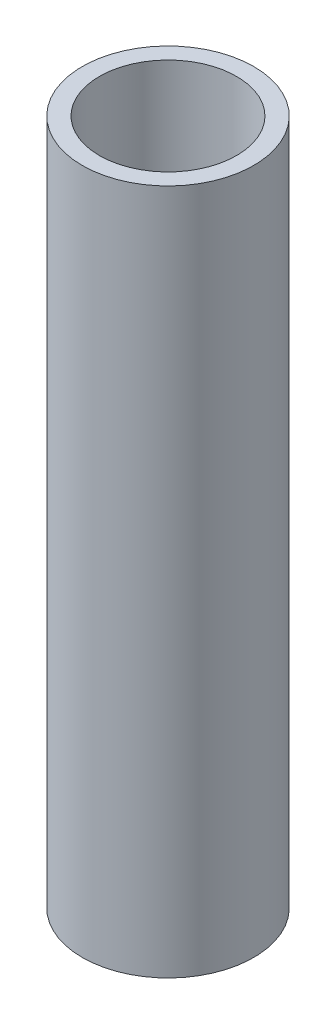
ISO-10303-21;
HEADER;
FILE_DESCRIPTION(('STEP AP214'),'2;1');
FILE_NAME('part.step','',(''),(''),'','','');
FILE_SCHEMA(('AUTOMOTIVE_DESIGN { 1 0 10303 214 1 1 1 1 }'));
ENDSEC;
DATA;
#1=APPLICATION_CONTEXT('core data for automotive mechanical design processes');
#2=APPLICATION_PROTOCOL_DEFINITION('international standard','automotive_design',2000,#1);
#3=PRODUCT_CONTEXT('',#1,'mechanical');
#4=PRODUCT('Part','Part','',(#3));
#5=PRODUCT_RELATED_PRODUCT_CATEGORY('part','',(#4));
#6=PRODUCT_DEFINITION_FORMATION('','',#4);
#7=PRODUCT_DEFINITION_CONTEXT('part definition',#1,'design');
#8=PRODUCT_DEFINITION('design','',#6,#7);
#9=PRODUCT_DEFINITION_SHAPE('','',#8);
#10=(LENGTH_UNIT() NAMED_UNIT(*) SI_UNIT(.MILLI.,.METRE.));
#11=(NAMED_UNIT(*) PLANE_ANGLE_UNIT() SI_UNIT($,.RADIAN.));
#12=(NAMED_UNIT(*) SI_UNIT($,.STERADIAN.) SOLID_ANGLE_UNIT());
#13=UNCERTAINTY_MEASURE_WITH_UNIT(LENGTH_MEASURE(1.E-05),#10,'distance_accuracy_value','');
#14=(GEOMETRIC_REPRESENTATION_CONTEXT(3) GLOBAL_UNCERTAINTY_ASSIGNED_CONTEXT((#13)) GLOBAL_UNIT_ASSIGNED_CONTEXT((#10,
#11,#12)) REPRESENTATION_CONTEXT('',''));
#15=CARTESIAN_POINT('',(0.,0.,0.));
#16=DIRECTION('',(0.,0.,1.));
#17=DIRECTION('',(1.,0.,0.));
#18=AXIS2_PLACEMENT_3D('',#15,#16,#17);
#19=CARTESIAN_POINT('',(0.,100.,0.));
#20=DIRECTION('',(0.,1.,0.));
#21=DIRECTION('',(0.,0.,1.));
#22=AXIS2_PLACEMENT_3D('',#19,#20,#21);
#23=PLANE('',#22);
#24=CARTESIAN_POINT('',(0.,100.,0.));
#25=DIRECTION('',(0.,1.,0.));
#26=DIRECTION('',(0.,0.,1.));
#27=AXIS2_PLACEMENT_3D('',#24,#25,#26);
#28=CIRCLE('',#27,12.5);
#29=CARTESIAN_POINT('',(0.,100.,12.5));
#30=VERTEX_POINT('',#29);
#31=EDGE_CURVE('E10',#30,#30,#28,.T.);
#32=ORIENTED_EDGE('',*,*,#31,.T.);
#33=EDGE_LOOP('',(#32));
#34=FACE_BOUND('',#33,.T.);
#35=CARTESIAN_POINT('',(0.,100.,0.));
#36=DIRECTION('',(0.,1.,0.));
#37=DIRECTION('',(0.,0.,1.));
#38=AXIS2_PLACEMENT_3D('',#35,#36,#37);
#39=CIRCLE('',#38,10.);
#40=CARTESIAN_POINT('',(0.,100.,10.));
#41=VERTEX_POINT('',#40);
#42=EDGE_CURVE('E46',#41,#41,#39,.T.);
#43=ORIENTED_EDGE('',*,*,#42,.F.);
#44=EDGE_LOOP('',(#43));
#45=FACE_BOUND('',#44,.T.);
#46=ADVANCED_FACE('F35',(#34,#45),#23,.T.);
#47=CARTESIAN_POINT('',(0.,0.,0.));
#48=DIRECTION('',(0.,1.,0.));
#49=DIRECTION('',(0.,0.,1.));
#50=AXIS2_PLACEMENT_3D('',#47,#48,#49);
#51=PLANE('',#50);
#52=CARTESIAN_POINT('',(0.,0.,0.));
#53=DIRECTION('',(0.,1.,0.));
#54=DIRECTION('',(0.,0.,1.));
#55=AXIS2_PLACEMENT_3D('',#52,#53,#54);
#56=CIRCLE('',#55,12.5);
#57=CARTESIAN_POINT('',(0.,0.,12.5));
#58=VERTEX_POINT('',#57);
#59=EDGE_CURVE('E39',#58,#58,#56,.T.);
#60=ORIENTED_EDGE('',*,*,#59,.F.);
#61=EDGE_LOOP('',(#60));
#62=FACE_BOUND('',#61,.T.);
#63=CARTESIAN_POINT('',(0.,0.,0.));
#64=DIRECTION('',(0.,1.,0.));
#65=DIRECTION('',(0.,0.,1.));
#66=AXIS2_PLACEMENT_3D('',#63,#64,#65);
#67=CIRCLE('',#66,10.);
#68=CARTESIAN_POINT('',(0.,0.,10.));
#69=VERTEX_POINT('',#68);
#70=EDGE_CURVE('E48',#69,#69,#67,.T.);
#71=ORIENTED_EDGE('',*,*,#70,.T.);
#72=EDGE_LOOP('',(#71));
#73=FACE_BOUND('',#72,.T.);
#74=ADVANCED_FACE('F58',(#62,#73),#51,.F.);
#75=CARTESIAN_POINT('',(0.,100.,0.));
#76=DIRECTION('',(0.,-1.,0.));
#77=DIRECTION('',(0.,0.,-1.));
#78=AXIS2_PLACEMENT_3D('',#75,#76,#77);
#79=CYLINDRICAL_SURFACE('',#78,12.5);
#80=ORIENTED_EDGE('',*,*,#31,.F.);
#81=EDGE_LOOP('',(#80));
#82=FACE_BOUND('',#81,.T.);
#83=ORIENTED_EDGE('',*,*,#59,.T.);
#84=EDGE_LOOP('',(#83));
#85=FACE_BOUND('',#84,.T.);
#86=ADVANCED_FACE('F37',(#82,#85),#79,.T.);
#87=CARTESIAN_POINT('',(0.,100.,0.));
#88=DIRECTION('',(0.,-1.,0.));
#89=DIRECTION('',(0.,0.,-1.));
#90=AXIS2_PLACEMENT_3D('',#87,#88,#89);
#91=CYLINDRICAL_SURFACE('',#90,10.);
#92=ORIENTED_EDGE('',*,*,#42,.T.);
#93=EDGE_LOOP('',(#92));
#94=FACE_BOUND('',#93,.T.);
#95=ORIENTED_EDGE('',*,*,#70,.F.);
#96=EDGE_LOOP('',(#95));
#97=FACE_BOUND('',#96,.T.);
#98=ADVANCED_FACE('F54',(#94,#97),#91,.F.);
#99=CLOSED_SHELL('',(#46,#74,#86,#98));
#100=MANIFOLD_SOLID_BREP('B2',#99);
#101=ADVANCED_BREP_SHAPE_REPRESENTATION('',(#18,#100),#14);
#102=SHAPE_DEFINITION_REPRESENTATION(#9,#101);
ENDSEC;
END-ISO-10303-21;
